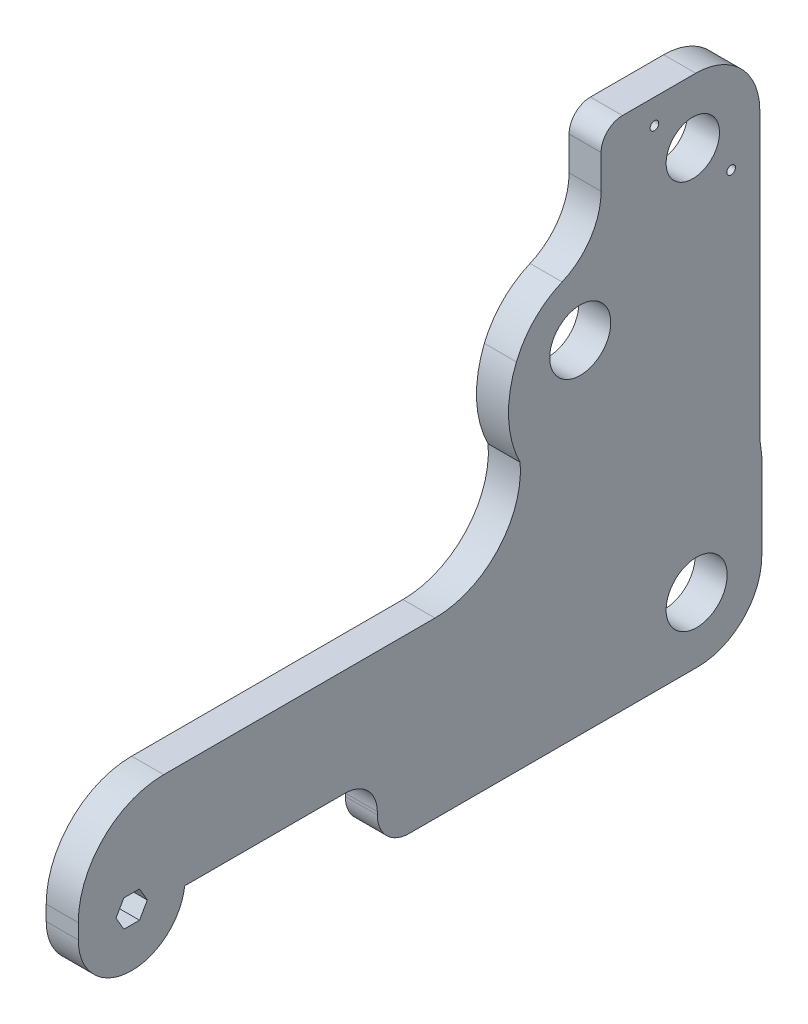
ISO-10303-21;
HEADER;
FILE_DESCRIPTION(('STEP AP214'),'2;1');
FILE_NAME('part.step','',(''),(''),'','','');
FILE_SCHEMA(('AUTOMOTIVE_DESIGN { 1 0 10303 214 1 1 1 1 }'));
ENDSEC;
DATA;
#1=APPLICATION_CONTEXT('core data for automotive mechanical design processes');
#2=APPLICATION_PROTOCOL_DEFINITION('international standard','automotive_design',2000,#1);
#3=PRODUCT_CONTEXT('',#1,'mechanical');
#4=PRODUCT('Part','Part','',(#3));
#5=PRODUCT_RELATED_PRODUCT_CATEGORY('part','',(#4));
#6=PRODUCT_DEFINITION_FORMATION('','',#4);
#7=PRODUCT_DEFINITION_CONTEXT('part definition',#1,'design');
#8=PRODUCT_DEFINITION('design','',#6,#7);
#9=PRODUCT_DEFINITION_SHAPE('','',#8);
#10=(LENGTH_UNIT() NAMED_UNIT(*) SI_UNIT(.MILLI.,.METRE.));
#11=(NAMED_UNIT(*) PLANE_ANGLE_UNIT() SI_UNIT($,.RADIAN.));
#12=(NAMED_UNIT(*) SI_UNIT($,.STERADIAN.) SOLID_ANGLE_UNIT());
#13=UNCERTAINTY_MEASURE_WITH_UNIT(LENGTH_MEASURE(1.E-05),#10,'distance_accuracy_value','');
#14=(GEOMETRIC_REPRESENTATION_CONTEXT(3) GLOBAL_UNCERTAINTY_ASSIGNED_CONTEXT((#13)) GLOBAL_UNIT_ASSIGNED_CONTEXT((#10,
#11,#12)) REPRESENTATION_CONTEXT('',''));
#15=CARTESIAN_POINT('',(0.,0.,0.));
#16=DIRECTION('',(0.,0.,1.));
#17=DIRECTION('',(1.,0.,0.));
#18=AXIS2_PLACEMENT_3D('',#15,#16,#17);
#19=CARTESIAN_POINT('',(15.,25.4000000000001,-90.));
#20=DIRECTION('',(1.,0.,0.));
#21=DIRECTION('',(0.,0.,-1.));
#22=AXIS2_PLACEMENT_3D('',#19,#20,#21);
#23=PLANE('',#22);
#24=CARTESIAN_POINT('',(15.,220.629214129618,-334.744996740449));
#25=DIRECTION('',(-1.,0.,0.));
#26=DIRECTION('',(0.,0.,1.));
#27=AXIS2_PLACEMENT_3D('',#24,#25,#26);
#28=CIRCLE('',#27,2.02000000001038);
#29=CARTESIAN_POINT('',(15.,220.629214129618,-332.724996740439));
#30=VERTEX_POINT('',#29);
#31=EDGE_CURVE('E264',#30,#30,#28,.T.);
#32=ORIENTED_EDGE('',*,*,#31,.T.);
#33=EDGE_LOOP('',(#32));
#34=FACE_BOUND('',#33,.T.);
#35=CARTESIAN_POINT('',(15.,184.708189645342,-370.666021224724));
#36=DIRECTION('',(-1.,0.,0.));
#37=DIRECTION('',(0.,0.,1.));
#38=AXIS2_PLACEMENT_3D('',#35,#36,#37);
#39=CIRCLE('',#38,2.0200000000083);
#40=CARTESIAN_POINT('',(15.,184.708189645342,-368.646021224716));
#41=VERTEX_POINT('',#40);
#42=EDGE_CURVE('E948',#41,#41,#39,.T.);
#43=ORIENTED_EDGE('',*,*,#42,.T.);
#44=EDGE_LOOP('',(#43));
#45=FACE_BOUND('',#44,.T.);
#46=CARTESIAN_POINT('',(15.,202.668701887479,-352.705508982585));
#47=DIRECTION('',(-1.,0.,0.));
#48=DIRECTION('',(0.,0.,1.));
#49=AXIS2_PLACEMENT_3D('',#46,#47,#48);
#50=CIRCLE('',#49,12.5000000000076);
#51=CARTESIAN_POINT('',(15.,202.668701887479,-340.205508982577));
#52=VERTEX_POINT('',#51);
#53=EDGE_CURVE('E954',#52,#52,#50,.T.);
#54=ORIENTED_EDGE('',*,*,#53,.T.);
#55=EDGE_LOOP('',(#54));
#56=FACE_BOUND('',#55,.T.);
#57=DIRECTION('',(0.,1.,0.));
#58=VECTOR('',#57,1.);
#59=CARTESIAN_POINT('',(15.,182.020805528476,-309.780230989161));
#60=LINE('',#59,#58);
#61=CARTESIAN_POINT('',(15.,206.52903796363,-309.780230989161));
#62=VERTEX_POINT('',#61);
#63=CARTESIAN_POINT('',(15.,222.254755045326,-309.780230989161));
#64=VERTEX_POINT('',#63);
#65=EDGE_CURVE('E223',#62,#64,#60,.T.);
#66=ORIENTED_EDGE('',*,*,#65,.F.);
#67=CARTESIAN_POINT('',(15.,206.52903796363,-279.780230989162));
#68=DIRECTION('',(1.,0.,0.));
#69=DIRECTION('',(0.,0.,-1.));
#70=AXIS2_PLACEMENT_3D('',#67,#68,#69);
#71=CIRCLE('',#70,30.);
#72=CARTESIAN_POINT('',(15.,178.919421923408,-291.515183145498));
#73=VERTEX_POINT('',#72);
#74=EDGE_CURVE('E11',#62,#73,#71,.F.);
#75=ORIENTED_EDGE('',*,*,#74,.T.);
#76=CARTESIAN_POINT('',(15.,142.106600536445,-307.161786020613));
#77=DIRECTION('',(1.,0.,0.));
#78=DIRECTION('',(0.,0.,-1.));
#79=AXIS2_PLACEMENT_3D('',#76,#77,#78);
#80=CIRCLE('',#79,40.);
#81=CARTESIAN_POINT('',(15.,157.195602303218,-270.116920982631));
#82=VERTEX_POINT('',#81);
#83=EDGE_CURVE('E526',#73,#82,#80,.T.);
#84=ORIENTED_EDGE('',*,*,#83,.T.);
#85=CARTESIAN_POINT('',(15.,138.334350094752,-316.423002280109));
#86=DIRECTION('',(-1.,0.,0.));
#87=DIRECTION('',(0.,0.,1.));
#88=AXIS2_PLACEMENT_3D('',#85,#86,#87);
#89=CIRCLE('',#88,50.);
#90=CARTESIAN_POINT('',(15.,115.607077366884,-271.8868251389));
#91=VERTEX_POINT('',#90);
#92=EDGE_CURVE('E305',#91,#82,#89,.T.);
#93=ORIENTED_EDGE('',*,*,#92,.F.);
#94=CARTESIAN_POINT('',(15.,112.4,-232.015599238976));
#95=DIRECTION('',(1.,0.,0.));
#96=DIRECTION('',(0.,0.,-1.));
#97=AXIS2_PLACEMENT_3D('',#94,#95,#96);
#98=CIRCLE('',#97,40.);
#99=CARTESIAN_POINT('',(15.,72.4,-232.015599238976));
#100=VERTEX_POINT('',#99);
#101=EDGE_CURVE('E520',#91,#100,#98,.F.);
#102=ORIENTED_EDGE('',*,*,#101,.T.);
#103=DIRECTION('',(0.,0.,-1.));
#104=VECTOR('',#103,1.);
#105=CARTESIAN_POINT('',(15.,72.4,-65.));
#106=LINE('',#105,#104);
#107=CARTESIAN_POINT('',(15.,72.4,-105.));
#108=VERTEX_POINT('',#107);
#109=EDGE_CURVE('E299',#108,#100,#106,.T.);
#110=ORIENTED_EDGE('',*,*,#109,.F.);
#111=CARTESIAN_POINT('',(15.,32.4000000000001,-105.));
#112=DIRECTION('',(1.,0.,0.));
#113=DIRECTION('',(0.,0.,-1.));
#114=AXIS2_PLACEMENT_3D('',#111,#112,#113);
#115=CIRCLE('',#114,40.);
#116=CARTESIAN_POINT('',(15.,32.4000000000001,-65.));
#117=VERTEX_POINT('',#116);
#118=EDGE_CURVE('E511',#108,#117,#115,.T.);
#119=ORIENTED_EDGE('',*,*,#118,.T.);
#120=DIRECTION('',(0.,1.,0.));
#121=VECTOR('',#120,1.);
#122=CARTESIAN_POINT('',(15.,25.4,-65.));
#123=LINE('',#122,#121);
#124=CARTESIAN_POINT('',(15.,25.4,-65.));
#125=VERTEX_POINT('',#124);
#126=EDGE_CURVE('E419',#125,#117,#123,.T.);
#127=ORIENTED_EDGE('',*,*,#126,.F.);
#128=CARTESIAN_POINT('',(15.,25.4000000000001,-90.));
#129=DIRECTION('',(1.,0.,0.));
#130=DIRECTION('',(0.,0.,-1.));
#131=AXIS2_PLACEMENT_3D('',#128,#129,#130);
#132=CIRCLE('',#131,25.);
#133=CARTESIAN_POINT('',(15.,22.4000000000001,-114.819347291982));
#134=VERTEX_POINT('',#133);
#135=EDGE_CURVE('E399',#125,#134,#132,.T.);
#136=ORIENTED_EDGE('',*,*,#135,.T.);
#137=DIRECTION('',(0.,0.,1.));
#138=VECTOR('',#137,1.);
#139=CARTESIAN_POINT('',(15.,22.4000000000001,-115.));
#140=LINE('',#139,#138);
#141=CARTESIAN_POINT('',(15.,22.4000000000001,-190.));
#142=VERTEX_POINT('',#141);
#143=EDGE_CURVE('E403',#142,#134,#140,.T.);
#144=ORIENTED_EDGE('',*,*,#143,.F.);
#145=CARTESIAN_POINT('',(15.,7.40000000000005,-190.));
#146=DIRECTION('',(1.,0.,0.));
#147=DIRECTION('',(0.,0.,-1.));
#148=AXIS2_PLACEMENT_3D('',#145,#146,#147);
#149=CIRCLE('',#148,15.);
#150=CARTESIAN_POINT('',(15.,7.40000000000005,-205.));
#151=VERTEX_POINT('',#150);
#152=EDGE_CURVE('E485',#142,#151,#149,.F.);
#153=ORIENTED_EDGE('',*,*,#152,.T.);
#154=DIRECTION('',(0.,-1.,0.));
#155=VECTOR('',#154,1.);
#156=CARTESIAN_POINT('',(15.,22.4000000000001,-205.));
#157=LINE('',#156,#155);
#158=CARTESIAN_POINT('',(15.,6.06162282000004,-205.));
#159=VERTEX_POINT('',#158);
#160=EDGE_CURVE('E407',#151,#159,#157,.T.);
#161=ORIENTED_EDGE('',*,*,#160,.T.);
#162=CARTESIAN_POINT('',(15.,6.06162282000004,-220.));
#163=DIRECTION('',(1.,0.,0.));
#164=DIRECTION('',(0.,0.,-1.));
#165=AXIS2_PLACEMENT_3D('',#162,#163,#164);
#166=CIRCLE('',#165,15.);
#167=CARTESIAN_POINT('',(15.,-8.93837717999996,-220.));
#168=VERTEX_POINT('',#167);
#169=EDGE_CURVE('E479',#159,#168,#166,.T.);
#170=ORIENTED_EDGE('',*,*,#169,.T.);
#171=DIRECTION('',(0.,0.,-1.));
#172=VECTOR('',#171,1.);
#173=CARTESIAN_POINT('',(15.,-8.93837717999996,-205.));
#174=LINE('',#173,#172);
#175=CARTESIAN_POINT('',(15.,-8.93837717999996,-355.));
#176=VERTEX_POINT('',#175);
#177=EDGE_CURVE('E411',#168,#176,#174,.T.);
#178=ORIENTED_EDGE('',*,*,#177,.T.);
#179=CARTESIAN_POINT('',(15.,21.06162282,-355.));
#180=DIRECTION('',(1.,0.,0.));
#181=DIRECTION('',(0.,0.,-1.));
#182=AXIS2_PLACEMENT_3D('',#179,#180,#181);
#183=CIRCLE('',#182,30.);
#184=CARTESIAN_POINT('',(15.,21.06162282,-385.));
#185=VERTEX_POINT('',#184);
#186=EDGE_CURVE('E498',#176,#185,#183,.T.);
#187=ORIENTED_EDGE('',*,*,#186,.T.);
#188=DIRECTION('',(0.,-1.,0.));
#189=VECTOR('',#188,1.);
#190=CARTESIAN_POINT('',(15.,281.06162282,-385.));
#191=LINE('',#190,#189);
#192=CARTESIAN_POINT('',(15.,61.0616228200001,-385.));
#193=VERTEX_POINT('',#192);
#194=EDGE_CURVE('E415',#193,#185,#191,.T.);
#195=ORIENTED_EDGE('',*,*,#194,.F.);
#196=CARTESIAN_POINT('',(15.,61.06162282,-165.));
#197=DIRECTION('',(1.,0.,0.));
#198=DIRECTION('',(0.,0.,-1.));
#199=AXIS2_PLACEMENT_3D('',#196,#197,#198);
#200=CIRCLE('',#199,220.);
#201=CARTESIAN_POINT('',(15.,61.5516614787209,-384.999454231398));
#202=VERTEX_POINT('',#201);
#203=EDGE_CURVE('E458',#193,#202,#200,.T.);
#204=ORIENTED_EDGE('',*,*,#203,.T.);
#205=CARTESIAN_POINT('',(15.,41.3040957033272,-196.081387122476));
#206=DIRECTION('',(-1.,0.,0.));
#207=DIRECTION('',(0.,0.,-1.));
#208=AXIS2_PLACEMENT_3D('',#205,#206,#207);
#209=CIRCLE('',#208,190.);
#210=CARTESIAN_POINT('',(15.,68.8062053431013,-384.080413653505));
#211=VERTEX_POINT('',#210);
#212=EDGE_CURVE('E281',#211,#202,#209,.T.);
#213=ORIENTED_EDGE('',*,*,#212,.F.);
#214=DIRECTION('',(0.,-1.,0.));
#215=VECTOR('',#214,1.);
#216=CARTESIAN_POINT('',(15.,202.254755045326,-384.080413653505));
#217=LINE('',#216,#215);
#218=CARTESIAN_POINT('',(15.,202.254755045326,-384.080413653505));
#219=VERTEX_POINT('',#218);
#220=EDGE_CURVE('E242',#219,#211,#217,.T.);
#221=ORIENTED_EDGE('',*,*,#220,.F.);
#222=CARTESIAN_POINT('',(15.,202.254755045326,-354.080413653505));
#223=DIRECTION('',(-1.,0.,0.));
#224=DIRECTION('',(0.,0.,1.));
#225=AXIS2_PLACEMENT_3D('',#222,#223,#224);
#226=CIRCLE('',#225,30.);
#227=CARTESIAN_POINT('',(15.,232.254755045326,-354.080413653505));
#228=VERTEX_POINT('',#227);
#229=EDGE_CURVE('E252',#228,#219,#226,.T.);
#230=ORIENTED_EDGE('',*,*,#229,.F.);
#231=DIRECTION('',(0.,0.,-1.));
#232=VECTOR('',#231,1.);
#233=CARTESIAN_POINT('',(15.,232.254755045326,-354.080413653505));
#234=LINE('',#233,#232);
#235=CARTESIAN_POINT('',(15.,232.254755045326,-319.780230989161));
#236=VERTEX_POINT('',#235);
#237=EDGE_CURVE('E248',#236,#228,#234,.T.);
#238=ORIENTED_EDGE('',*,*,#237,.F.);
#239=CARTESIAN_POINT('',(15.,222.254755045326,-319.780230989161));
#240=DIRECTION('',(-1.,0.,0.));
#241=DIRECTION('',(0.,0.,-1.));
#242=AXIS2_PLACEMENT_3D('',#239,#240,#241);
#243=CIRCLE('',#242,10.);
#244=EDGE_CURVE('E232',#64,#236,#243,.T.);
#245=ORIENTED_EDGE('',*,*,#244,.F.);
#246=EDGE_LOOP('',(#66,#75,#84,#93,#102,#110,#119,#127,#136,#144,#153,#161,#170,#178,#187,#195,
#204,#213,#221,#230,#238,#245));
#247=FACE_BOUND('',#246,.T.);
#248=DIRECTION('',(0.,0.866025403784439,0.499999999999999));
#249=VECTOR('',#248,1.);
#250=CARTESIAN_POINT('',(15.,19.05,-86.3338257906459));
#251=LINE('',#250,#249);
#252=CARTESIAN_POINT('',(15.,19.05,-86.3338257906459));
#253=VERTEX_POINT('',#252);
#254=CARTESIAN_POINT('',(15.,25.4,-82.6676515812918));
#255=VERTEX_POINT('',#254);
#256=EDGE_CURVE('E333',#253,#255,#251,.T.);
#257=ORIENTED_EDGE('',*,*,#256,.T.);
#258=DIRECTION('',(0.,0.866025403784439,-0.5));
#259=VECTOR('',#258,1.);
#260=CARTESIAN_POINT('',(15.,25.4,-82.6676515812918));
#261=LINE('',#260,#259);
#262=CARTESIAN_POINT('',(15.,31.75,-86.3338257906459));
#263=VERTEX_POINT('',#262);
#264=EDGE_CURVE('E337',#255,#263,#261,.T.);
#265=ORIENTED_EDGE('',*,*,#264,.T.);
#266=DIRECTION('',(0.,0.,-1.));
#267=VECTOR('',#266,1.);
#268=CARTESIAN_POINT('',(15.,31.75,-86.3338257906459));
#269=LINE('',#268,#267);
#270=CARTESIAN_POINT('',(15.,31.75,-93.6661742093541));
#271=VERTEX_POINT('',#270);
#272=EDGE_CURVE('E342',#263,#271,#269,.T.);
#273=ORIENTED_EDGE('',*,*,#272,.T.);
#274=DIRECTION('',(0.,-0.866025403784439,-0.5));
#275=VECTOR('',#274,1.);
#276=CARTESIAN_POINT('',(15.,31.75,-93.6661742093541));
#277=LINE('',#276,#275);
#278=CARTESIAN_POINT('',(15.,25.4,-97.3323484187082));
#279=VERTEX_POINT('',#278);
#280=EDGE_CURVE('E346',#271,#279,#277,.T.);
#281=ORIENTED_EDGE('',*,*,#280,.T.);
#282=DIRECTION('',(0.,-0.866025403784439,0.5));
#283=VECTOR('',#282,1.);
#284=CARTESIAN_POINT('',(15.,25.4,-97.3323484187082));
#285=LINE('',#284,#283);
#286=CARTESIAN_POINT('',(15.,19.05,-93.6661742093541));
#287=VERTEX_POINT('',#286);
#288=EDGE_CURVE('E350',#279,#287,#285,.T.);
#289=ORIENTED_EDGE('',*,*,#288,.T.);
#290=DIRECTION('',(0.,0.,1.));
#291=VECTOR('',#290,1.);
#292=CARTESIAN_POINT('',(15.,19.05,-93.6661742093541));
#293=LINE('',#292,#291);
#294=EDGE_CURVE('E354',#287,#253,#293,.T.);
#295=ORIENTED_EDGE('',*,*,#294,.T.);
#296=EDGE_LOOP('',(#257,#265,#273,#281,#289,#295));
#297=FACE_BOUND('',#296,.T.);
#298=CARTESIAN_POINT('',(15.,21.5616228227509,-354.499999997544));
#299=DIRECTION('',(1.,0.,0.));
#300=DIRECTION('',(0.,0.,-1.));
#301=AXIS2_PLACEMENT_3D('',#298,#299,#300);
#302=CIRCLE('',#301,14.29);
#303=CARTESIAN_POINT('',(15.,21.5616228227509,-368.789999997544));
#304=VERTEX_POINT('',#303);
#305=EDGE_CURVE('E329',#304,#304,#302,.T.);
#306=ORIENTED_EDGE('',*,*,#305,.F.);
#307=EDGE_LOOP('',(#306));
#308=FACE_BOUND('',#307,.T.);
#309=CARTESIAN_POINT('',(15.,151.061622822751,-299.999999997544));
#310=DIRECTION('',(1.,0.,0.));
#311=DIRECTION('',(0.,0.,-1.));
#312=AXIS2_PLACEMENT_3D('',#309,#310,#311);
#313=CIRCLE('',#312,14.2899999999392);
#314=CARTESIAN_POINT('',(15.,151.061622822751,-314.289999997483));
#315=VERTEX_POINT('',#314);
#316=EDGE_CURVE('E319',#315,#315,#313,.T.);
#317=ORIENTED_EDGE('',*,*,#316,.F.);
#318=EDGE_LOOP('',(#317));
#319=FACE_BOUND('',#318,.T.);
#320=ADVANCED_FACE('F41',(#34,#45,#56,#247,#297,#308,#319),#23,.T.);
#321=CARTESIAN_POINT('',(0.,25.4000000000001,-90.));
#322=DIRECTION('',(1.,0.,0.));
#323=DIRECTION('',(0.,0.,-1.));
#324=AXIS2_PLACEMENT_3D('',#321,#322,#323);
#325=PLANE('',#324);
#326=CARTESIAN_POINT('',(0.,220.629214129618,-334.744996740449));
#327=DIRECTION('',(-1.,0.,0.));
#328=DIRECTION('',(0.,0.,1.));
#329=AXIS2_PLACEMENT_3D('',#326,#327,#328);
#330=CIRCLE('',#329,2.02000000001038);
#331=CARTESIAN_POINT('',(0.,220.629214129618,-332.724996740439));
#332=VERTEX_POINT('',#331);
#333=EDGE_CURVE('E958',#332,#332,#330,.T.);
#334=ORIENTED_EDGE('',*,*,#333,.F.);
#335=EDGE_LOOP('',(#334));
#336=FACE_BOUND('',#335,.T.);
#337=CARTESIAN_POINT('',(0.,184.708189645342,-370.666021224724));
#338=DIRECTION('',(-1.,0.,0.));
#339=DIRECTION('',(0.,0.,1.));
#340=AXIS2_PLACEMENT_3D('',#337,#338,#339);
#341=CIRCLE('',#340,2.0200000000083);
#342=CARTESIAN_POINT('',(0.,184.708189645342,-368.646021224716));
#343=VERTEX_POINT('',#342);
#344=EDGE_CURVE('E951',#343,#343,#341,.T.);
#345=ORIENTED_EDGE('',*,*,#344,.F.);
#346=EDGE_LOOP('',(#345));
#347=FACE_BOUND('',#346,.T.);
#348=CARTESIAN_POINT('',(0.,202.668701887479,-352.705508982585));
#349=DIRECTION('',(-1.,0.,0.));
#350=DIRECTION('',(0.,0.,1.));
#351=AXIS2_PLACEMENT_3D('',#348,#349,#350);
#352=CIRCLE('',#351,12.5000000000076);
#353=CARTESIAN_POINT('',(0.,202.668701887479,-340.205508982577));
#354=VERTEX_POINT('',#353);
#355=EDGE_CURVE('E961',#354,#354,#352,.T.);
#356=ORIENTED_EDGE('',*,*,#355,.F.);
#357=EDGE_LOOP('',(#356));
#358=FACE_BOUND('',#357,.T.);
#359=CARTESIAN_POINT('',(0.,151.061622822751,-299.999999997544));
#360=DIRECTION('',(1.,0.,0.));
#361=DIRECTION('',(0.,0.,-1.));
#362=AXIS2_PLACEMENT_3D('',#359,#360,#361);
#363=CIRCLE('',#362,14.2899999999392);
#364=CARTESIAN_POINT('',(0.,151.061622822751,-314.289999997483));
#365=VERTEX_POINT('',#364);
#366=EDGE_CURVE('E323',#365,#365,#363,.T.);
#367=ORIENTED_EDGE('',*,*,#366,.T.);
#368=EDGE_LOOP('',(#367));
#369=FACE_BOUND('',#368,.T.);
#370=CARTESIAN_POINT('',(0.,21.5616228227509,-354.499999997544));
#371=DIRECTION('',(1.,0.,0.));
#372=DIRECTION('',(0.,0.,-1.));
#373=AXIS2_PLACEMENT_3D('',#370,#371,#372);
#374=CIRCLE('',#373,14.29);
#375=CARTESIAN_POINT('',(0.,21.5616228227509,-368.789999997544));
#376=VERTEX_POINT('',#375);
#377=EDGE_CURVE('E324',#376,#376,#374,.T.);
#378=ORIENTED_EDGE('',*,*,#377,.T.);
#379=EDGE_LOOP('',(#378));
#380=FACE_BOUND('',#379,.T.);
#381=DIRECTION('',(0.,0.866025403784439,-0.5));
#382=VECTOR('',#381,1.);
#383=CARTESIAN_POINT('',(0.,25.4,-82.6676515812918));
#384=LINE('',#383,#382);
#385=CARTESIAN_POINT('',(0.,25.4,-82.6676515812918));
#386=VERTEX_POINT('',#385);
#387=CARTESIAN_POINT('',(0.,31.75,-86.3338257906459));
#388=VERTEX_POINT('',#387);
#389=EDGE_CURVE('E361',#386,#388,#384,.T.);
#390=ORIENTED_EDGE('',*,*,#389,.F.);
#391=DIRECTION('',(0.,0.866025403784439,0.499999999999999));
#392=VECTOR('',#391,1.);
#393=CARTESIAN_POINT('',(0.,19.05,-86.3338257906459));
#394=LINE('',#393,#392);
#395=CARTESIAN_POINT('',(0.,19.05,-86.3338257906459));
#396=VERTEX_POINT('',#395);
#397=EDGE_CURVE('E328',#396,#386,#394,.T.);
#398=ORIENTED_EDGE('',*,*,#397,.F.);
#399=DIRECTION('',(0.,0.,1.));
#400=VECTOR('',#399,1.);
#401=CARTESIAN_POINT('',(0.,19.05,-93.6661742093541));
#402=LINE('',#401,#400);
#403=CARTESIAN_POINT('',(0.,19.05,-93.6661742093541));
#404=VERTEX_POINT('',#403);
#405=EDGE_CURVE('E338',#404,#396,#402,.T.);
#406=ORIENTED_EDGE('',*,*,#405,.F.);
#407=DIRECTION('',(0.,-0.866025403784439,0.5));
#408=VECTOR('',#407,1.);
#409=CARTESIAN_POINT('',(0.,25.4,-97.3323484187082));
#410=LINE('',#409,#408);
#411=CARTESIAN_POINT('',(0.,25.4,-97.3323484187082));
#412=VERTEX_POINT('',#411);
#413=EDGE_CURVE('E373',#412,#404,#410,.T.);
#414=ORIENTED_EDGE('',*,*,#413,.F.);
#415=DIRECTION('',(0.,-0.866025403784439,-0.5));
#416=VECTOR('',#415,1.);
#417=CARTESIAN_POINT('',(0.,31.75,-93.6661742093541));
#418=LINE('',#417,#416);
#419=CARTESIAN_POINT('',(0.,31.75,-93.6661742093541));
#420=VERTEX_POINT('',#419);
#421=EDGE_CURVE('E369',#420,#412,#418,.T.);
#422=ORIENTED_EDGE('',*,*,#421,.F.);
#423=DIRECTION('',(0.,0.,-1.));
#424=VECTOR('',#423,1.);
#425=CARTESIAN_POINT('',(0.,31.75,-86.3338257906459));
#426=LINE('',#425,#424);
#427=EDGE_CURVE('E365',#388,#420,#426,.T.);
#428=ORIENTED_EDGE('',*,*,#427,.F.);
#429=EDGE_LOOP('',(#390,#398,#406,#414,#422,#428));
#430=FACE_BOUND('',#429,.T.);
#431=CARTESIAN_POINT('',(0.,142.106600536445,-307.161786020613));
#432=DIRECTION('',(1.,0.,0.));
#433=DIRECTION('',(0.,0.,-1.));
#434=AXIS2_PLACEMENT_3D('',#431,#432,#433);
#435=CIRCLE('',#434,40.);
#436=CARTESIAN_POINT('',(0.,157.195602303218,-270.116920982631));
#437=VERTEX_POINT('',#436);
#438=CARTESIAN_POINT('',(0.,178.919421923408,-291.515183145498));
#439=VERTEX_POINT('',#438);
#440=EDGE_CURVE('E532',#437,#439,#435,.F.);
#441=ORIENTED_EDGE('',*,*,#440,.T.);
#442=CARTESIAN_POINT('',(0.,206.52903796363,-279.780230989162));
#443=DIRECTION('',(1.,0.,0.));
#444=DIRECTION('',(0.,0.,-1.));
#445=AXIS2_PLACEMENT_3D('',#442,#443,#444);
#446=CIRCLE('',#445,30.);
#447=CARTESIAN_POINT('',(0.,206.52903796363,-309.780230989161));
#448=VERTEX_POINT('',#447);
#449=EDGE_CURVE('E50',#439,#448,#446,.T.);
#450=ORIENTED_EDGE('',*,*,#449,.T.);
#451=DIRECTION('',(0.,1.,0.));
#452=VECTOR('',#451,1.);
#453=CARTESIAN_POINT('',(0.,182.020805528476,-309.780230989161));
#454=LINE('',#453,#452);
#455=CARTESIAN_POINT('',(0.,222.254755045326,-309.780230989161));
#456=VERTEX_POINT('',#455);
#457=EDGE_CURVE('E261',#448,#456,#454,.T.);
#458=ORIENTED_EDGE('',*,*,#457,.T.);
#459=CARTESIAN_POINT('',(0.,222.254755045326,-319.780230989161));
#460=DIRECTION('',(-1.,0.,0.));
#461=DIRECTION('',(0.,0.,-1.));
#462=AXIS2_PLACEMENT_3D('',#459,#460,#461);
#463=CIRCLE('',#462,10.);
#464=CARTESIAN_POINT('',(0.,232.254755045326,-319.780230989161));
#465=VERTEX_POINT('',#464);
#466=EDGE_CURVE('E239',#456,#465,#463,.T.);
#467=ORIENTED_EDGE('',*,*,#466,.T.);
#468=DIRECTION('',(0.,0.,-1.));
#469=VECTOR('',#468,1.);
#470=CARTESIAN_POINT('',(0.,232.254755045326,-354.080413653505));
#471=LINE('',#470,#469);
#472=CARTESIAN_POINT('',(0.,232.254755045326,-354.080413653505));
#473=VERTEX_POINT('',#472);
#474=EDGE_CURVE('E267',#465,#473,#471,.T.);
#475=ORIENTED_EDGE('',*,*,#474,.T.);
#476=CARTESIAN_POINT('',(0.,202.254755045326,-354.080413653505));
#477=DIRECTION('',(-1.,0.,0.));
#478=DIRECTION('',(0.,0.,1.));
#479=AXIS2_PLACEMENT_3D('',#476,#477,#478);
#480=CIRCLE('',#479,30.);
#481=CARTESIAN_POINT('',(0.,202.254755045326,-384.080413653505));
#482=VERTEX_POINT('',#481);
#483=EDGE_CURVE('E271',#473,#482,#480,.T.);
#484=ORIENTED_EDGE('',*,*,#483,.T.);
#485=DIRECTION('',(0.,-1.,0.));
#486=VECTOR('',#485,1.);
#487=CARTESIAN_POINT('',(0.,202.254755045326,-384.080413653505));
#488=LINE('',#487,#486);
#489=CARTESIAN_POINT('',(0.,68.8062053431013,-384.080413653505));
#490=VERTEX_POINT('',#489);
#491=EDGE_CURVE('E233',#482,#490,#488,.T.);
#492=ORIENTED_EDGE('',*,*,#491,.T.);
#493=CARTESIAN_POINT('',(0.,41.3040957033272,-196.081387122476));
#494=DIRECTION('',(-1.,0.,0.));
#495=DIRECTION('',(0.,0.,-1.));
#496=AXIS2_PLACEMENT_3D('',#493,#494,#495);
#497=CIRCLE('',#496,190.);
#498=CARTESIAN_POINT('',(0.,61.5516614787209,-384.999454231398));
#499=VERTEX_POINT('',#498);
#500=EDGE_CURVE('E290',#490,#499,#497,.T.);
#501=ORIENTED_EDGE('',*,*,#500,.T.);
#502=CARTESIAN_POINT('',(0.,61.06162282,-165.));
#503=DIRECTION('',(1.,0.,0.));
#504=DIRECTION('',(0.,0.,-1.));
#505=AXIS2_PLACEMENT_3D('',#502,#503,#504);
#506=CIRCLE('',#505,220.);
#507=CARTESIAN_POINT('',(0.,61.0616228200001,-385.));
#508=VERTEX_POINT('',#507);
#509=EDGE_CURVE('E452',#499,#508,#506,.F.);
#510=ORIENTED_EDGE('',*,*,#509,.T.);
#511=DIRECTION('',(0.,-1.,0.));
#512=VECTOR('',#511,1.);
#513=CARTESIAN_POINT('',(0.,281.06162282,-385.));
#514=LINE('',#513,#512);
#515=CARTESIAN_POINT('',(0.,21.06162282,-385.));
#516=VERTEX_POINT('',#515);
#517=EDGE_CURVE('E439',#508,#516,#514,.T.);
#518=ORIENTED_EDGE('',*,*,#517,.T.);
#519=CARTESIAN_POINT('',(0.,21.06162282,-355.));
#520=DIRECTION('',(1.,0.,0.));
#521=DIRECTION('',(0.,0.,-1.));
#522=AXIS2_PLACEMENT_3D('',#519,#520,#521);
#523=CIRCLE('',#522,30.);
#524=CARTESIAN_POINT('',(0.,-8.93837717999996,-355.));
#525=VERTEX_POINT('',#524);
#526=EDGE_CURVE('E492',#516,#525,#523,.F.);
#527=ORIENTED_EDGE('',*,*,#526,.T.);
#528=DIRECTION('',(0.,0.,-1.));
#529=VECTOR('',#528,1.);
#530=CARTESIAN_POINT('',(0.,-8.93837717999996,-205.));
#531=LINE('',#530,#529);
#532=CARTESIAN_POINT('',(0.,-8.93837717999996,-220.));
#533=VERTEX_POINT('',#532);
#534=EDGE_CURVE('E435',#533,#525,#531,.T.);
#535=ORIENTED_EDGE('',*,*,#534,.F.);
#536=CARTESIAN_POINT('',(0.,6.06162282000004,-220.));
#537=DIRECTION('',(1.,0.,0.));
#538=DIRECTION('',(0.,0.,-1.));
#539=AXIS2_PLACEMENT_3D('',#536,#537,#538);
#540=CIRCLE('',#539,15.);
#541=CARTESIAN_POINT('',(0.,6.06162282000004,-205.));
#542=VERTEX_POINT('',#541);
#543=EDGE_CURVE('E476',#533,#542,#540,.F.);
#544=ORIENTED_EDGE('',*,*,#543,.T.);
#545=DIRECTION('',(0.,-1.,0.));
#546=VECTOR('',#545,1.);
#547=CARTESIAN_POINT('',(0.,22.4000000000001,-205.));
#548=LINE('',#547,#546);
#549=CARTESIAN_POINT('',(0.,7.40000000000005,-205.));
#550=VERTEX_POINT('',#549);
#551=EDGE_CURVE('E431',#550,#542,#548,.T.);
#552=ORIENTED_EDGE('',*,*,#551,.F.);
#553=CARTESIAN_POINT('',(0.,7.40000000000005,-190.));
#554=DIRECTION('',(1.,0.,0.));
#555=DIRECTION('',(0.,0.,-1.));
#556=AXIS2_PLACEMENT_3D('',#553,#554,#555);
#557=CIRCLE('',#556,15.);
#558=CARTESIAN_POINT('',(0.,22.4000000000001,-190.));
#559=VERTEX_POINT('',#558);
#560=EDGE_CURVE('E482',#550,#559,#557,.T.);
#561=ORIENTED_EDGE('',*,*,#560,.T.);
#562=DIRECTION('',(0.,0.,-1.));
#563=VECTOR('',#562,1.);
#564=CARTESIAN_POINT('',(0.,22.4000000000001,-115.));
#565=LINE('',#564,#563);
#566=CARTESIAN_POINT('',(0.,22.4000000000001,-114.819347291982));
#567=VERTEX_POINT('',#566);
#568=EDGE_CURVE('E427',#567,#559,#565,.T.);
#569=ORIENTED_EDGE('',*,*,#568,.F.);
#570=CARTESIAN_POINT('',(0.,25.4000000000001,-90.));
#571=DIRECTION('',(1.,0.,0.));
#572=DIRECTION('',(0.,0.,-1.));
#573=AXIS2_PLACEMENT_3D('',#570,#571,#572);
#574=CIRCLE('',#573,25.);
#575=CARTESIAN_POINT('',(0.,25.4,-65.));
#576=VERTEX_POINT('',#575);
#577=EDGE_CURVE('E383',#576,#567,#574,.T.);
#578=ORIENTED_EDGE('',*,*,#577,.F.);
#579=DIRECTION('',(0.,1.,0.));
#580=VECTOR('',#579,1.);
#581=CARTESIAN_POINT('',(0.,25.4,-65.));
#582=LINE('',#581,#580);
#583=CARTESIAN_POINT('',(0.,32.4000000000001,-65.));
#584=VERTEX_POINT('',#583);
#585=EDGE_CURVE('E404',#576,#584,#582,.T.);
#586=ORIENTED_EDGE('',*,*,#585,.T.);
#587=CARTESIAN_POINT('',(0.,32.4000000000001,-105.));
#588=DIRECTION('',(1.,0.,0.));
#589=DIRECTION('',(0.,0.,-1.));
#590=AXIS2_PLACEMENT_3D('',#587,#588,#589);
#591=CIRCLE('',#590,40.);
#592=CARTESIAN_POINT('',(0.,72.4,-105.));
#593=VERTEX_POINT('',#592);
#594=EDGE_CURVE('E517',#584,#593,#591,.F.);
#595=ORIENTED_EDGE('',*,*,#594,.T.);
#596=DIRECTION('',(0.,0.,-1.));
#597=VECTOR('',#596,1.);
#598=CARTESIAN_POINT('',(0.,72.4,-65.));
#599=LINE('',#598,#597);
#600=CARTESIAN_POINT('',(0.,72.4,-232.015599238976));
#601=VERTEX_POINT('',#600);
#602=EDGE_CURVE('E300',#593,#601,#599,.T.);
#603=ORIENTED_EDGE('',*,*,#602,.T.);
#604=CARTESIAN_POINT('',(0.,112.4,-232.015599238976));
#605=DIRECTION('',(1.,0.,0.));
#606=DIRECTION('',(0.,0.,-1.));
#607=AXIS2_PLACEMENT_3D('',#604,#605,#606);
#608=CIRCLE('',#607,40.);
#609=CARTESIAN_POINT('',(0.,115.607077366884,-271.8868251389));
#610=VERTEX_POINT('',#609);
#611=EDGE_CURVE('E523',#601,#610,#608,.T.);
#612=ORIENTED_EDGE('',*,*,#611,.T.);
#613=CARTESIAN_POINT('',(0.,138.334350094752,-316.423002280109));
#614=DIRECTION('',(-1.,0.,0.));
#615=DIRECTION('',(0.,0.,1.));
#616=AXIS2_PLACEMENT_3D('',#613,#614,#615);
#617=CIRCLE('',#616,50.);
#618=EDGE_CURVE('E304',#610,#437,#617,.T.);
#619=ORIENTED_EDGE('',*,*,#618,.T.);
#620=EDGE_LOOP('',(#441,#450,#458,#467,#475,#484,#492,#501,#510,#518,#527,#535,#544,#552,#561,
#569,#578,#586,#595,#603,#612,#619));
#621=FACE_BOUND('',#620,.T.);
#622=ADVANCED_FACE('F548',(#336,#347,#358,#369,#380,#430,#621),#325,.F.);
#623=CARTESIAN_POINT('',(15.,61.06162282,-165.));
#624=DIRECTION('',(-1.,0.,0.));
#625=DIRECTION('',(0.,0.,1.));
#626=AXIS2_PLACEMENT_3D('',#623,#624,#625);
#627=CYLINDRICAL_SURFACE('',#626,220.);
#628=DIRECTION('',(1.,0.,0.));
#629=VECTOR('',#628,1.);
#630=CARTESIAN_POINT('',(7.5,61.5516614787209,-384.999454231398));
#631=LINE('',#630,#629);
#632=EDGE_CURVE('E293',#202,#499,#631,.F.);
#633=ORIENTED_EDGE('',*,*,#632,.F.);
#634=ORIENTED_EDGE('',*,*,#203,.F.);
#635=DIRECTION('',(-1.,0.,0.));
#636=VECTOR('',#635,1.);
#637=CARTESIAN_POINT('',(15.,61.0616228200001,-385.));
#638=LINE('',#637,#636);
#639=EDGE_CURVE('E455',#508,#193,#638,.F.);
#640=ORIENTED_EDGE('',*,*,#639,.F.);
#641=ORIENTED_EDGE('',*,*,#509,.F.);
#642=EDGE_LOOP('',(#633,#634,#640,#641));
#643=FACE_BOUND('',#642,.T.);
#644=ADVANCED_FACE('F610',(#643),#627,.T.);
#645=CARTESIAN_POINT('',(15.,25.4000000000001,-90.));
#646=DIRECTION('',(-1.,0.,0.));
#647=DIRECTION('',(0.,0.,1.));
#648=AXIS2_PLACEMENT_3D('',#645,#646,#647);
#649=CYLINDRICAL_SURFACE('',#648,25.);
#650=ORIENTED_EDGE('',*,*,#577,.T.);
#651=DIRECTION('',(-1.,0.,0.));
#652=VECTOR('',#651,1.);
#653=CARTESIAN_POINT('',(15.,22.4000000000001,-114.819347291982));
#654=LINE('',#653,#652);
#655=EDGE_CURVE('E448',#134,#567,#654,.T.);
#656=ORIENTED_EDGE('',*,*,#655,.F.);
#657=ORIENTED_EDGE('',*,*,#135,.F.);
#658=DIRECTION('',(-1.,0.,0.));
#659=VECTOR('',#658,1.);
#660=CARTESIAN_POINT('',(15.,25.4,-65.));
#661=LINE('',#660,#659);
#662=EDGE_CURVE('E423',#125,#576,#661,.T.);
#663=ORIENTED_EDGE('',*,*,#662,.T.);
#664=EDGE_LOOP('',(#650,#656,#657,#663));
#665=FACE_BOUND('',#664,.T.);
#666=ADVANCED_FACE('F575',(#665),#649,.T.);
#667=CARTESIAN_POINT('',(15.,22.4000000000001,-115.));
#668=DIRECTION('',(0.,1.,0.));
#669=DIRECTION('',(0.,0.,1.));
#670=AXIS2_PLACEMENT_3D('',#667,#668,#669);
#671=PLANE('',#670);
#672=ORIENTED_EDGE('',*,*,#568,.T.);
#673=DIRECTION('',(-1.,0.,0.));
#674=VECTOR('',#673,1.);
#675=CARTESIAN_POINT('',(15.,22.4,-190.));
#676=LINE('',#675,#674);
#677=EDGE_CURVE('E469',#559,#142,#676,.F.);
#678=ORIENTED_EDGE('',*,*,#677,.T.);
#679=ORIENTED_EDGE('',*,*,#143,.T.);
#680=ORIENTED_EDGE('',*,*,#655,.T.);
#681=EDGE_LOOP('',(#672,#678,#679,#680));
#682=FACE_BOUND('',#681,.T.);
#683=ADVANCED_FACE('F656',(#682),#671,.F.);
#684=CARTESIAN_POINT('',(15.,22.4000000000001,-205.));
#685=DIRECTION('',(0.,0.,-1.));
#686=DIRECTION('',(-1.,0.,0.));
#687=AXIS2_PLACEMENT_3D('',#684,#685,#686);
#688=PLANE('',#687);
#689=ORIENTED_EDGE('',*,*,#160,.F.);
#690=DIRECTION('',(-1.,0.,0.));
#691=VECTOR('',#690,1.);
#692=CARTESIAN_POINT('',(0.,7.40000000000005,-205.));
#693=LINE('',#692,#691);
#694=EDGE_CURVE('E465',#151,#550,#693,.T.);
#695=ORIENTED_EDGE('',*,*,#694,.T.);
#696=ORIENTED_EDGE('',*,*,#551,.T.);
#697=DIRECTION('',(-1.,0.,0.));
#698=VECTOR('',#697,1.);
#699=CARTESIAN_POINT('',(15.,6.06162282000004,-205.));
#700=LINE('',#699,#698);
#701=EDGE_CURVE('E462',#542,#159,#700,.F.);
#702=ORIENTED_EDGE('',*,*,#701,.T.);
#703=EDGE_LOOP('',(#689,#695,#696,#702));
#704=FACE_BOUND('',#703,.T.);
#705=ADVANCED_FACE('F586',(#704),#688,.F.);
#706=CARTESIAN_POINT('',(15.,-8.93837717999996,-205.));
#707=DIRECTION('',(0.,1.,0.));
#708=DIRECTION('',(0.,0.,1.));
#709=AXIS2_PLACEMENT_3D('',#706,#707,#708);
#710=PLANE('',#709);
#711=ORIENTED_EDGE('',*,*,#534,.T.);
#712=DIRECTION('',(-1.,0.,0.));
#713=VECTOR('',#712,1.);
#714=CARTESIAN_POINT('',(15.,-8.93837717999996,-355.));
#715=LINE('',#714,#713);
#716=EDGE_CURVE('E495',#525,#176,#715,.F.);
#717=ORIENTED_EDGE('',*,*,#716,.T.);
#718=ORIENTED_EDGE('',*,*,#177,.F.);
#719=DIRECTION('',(-1.,0.,0.));
#720=VECTOR('',#719,1.);
#721=CARTESIAN_POINT('',(15.,-8.93837717999996,-220.));
#722=LINE('',#721,#720);
#723=EDGE_CURVE('E472',#168,#533,#722,.T.);
#724=ORIENTED_EDGE('',*,*,#723,.T.);
#725=EDGE_LOOP('',(#711,#717,#718,#724));
#726=FACE_BOUND('',#725,.T.);
#727=ADVANCED_FACE('F595',(#726),#710,.F.);
#728=CARTESIAN_POINT('',(15.,281.06162282,-385.));
#729=DIRECTION('',(0.,0.,-1.));
#730=DIRECTION('',(0.,1.,0.));
#731=AXIS2_PLACEMENT_3D('',#728,#729,#730);
#732=PLANE('',#731);
#733=ORIENTED_EDGE('',*,*,#194,.T.);
#734=DIRECTION('',(-1.,0.,0.));
#735=VECTOR('',#734,1.);
#736=CARTESIAN_POINT('',(0.,21.06162282,-385.));
#737=LINE('',#736,#735);
#738=EDGE_CURVE('E488',#185,#516,#737,.T.);
#739=ORIENTED_EDGE('',*,*,#738,.T.);
#740=ORIENTED_EDGE('',*,*,#517,.F.);
#741=ORIENTED_EDGE('',*,*,#639,.T.);
#742=EDGE_LOOP('',(#733,#739,#740,#741));
#743=FACE_BOUND('',#742,.T.);
#744=ADVANCED_FACE('F604',(#743),#732,.T.);
#745=CARTESIAN_POINT('',(15.,25.4,-65.));
#746=DIRECTION('',(0.,0.,1.));
#747=DIRECTION('',(1.,0.,0.));
#748=AXIS2_PLACEMENT_3D('',#745,#746,#747);
#749=PLANE('',#748);
#750=ORIENTED_EDGE('',*,*,#126,.T.);
#751=DIRECTION('',(1.,0.,0.));
#752=VECTOR('',#751,1.);
#753=CARTESIAN_POINT('',(0.,32.4000000000001,-65.));
#754=LINE('',#753,#752);
#755=EDGE_CURVE('E514',#117,#584,#754,.F.);
#756=ORIENTED_EDGE('',*,*,#755,.T.);
#757=ORIENTED_EDGE('',*,*,#585,.F.);
#758=ORIENTED_EDGE('',*,*,#662,.F.);
#759=EDGE_LOOP('',(#750,#756,#757,#758));
#760=FACE_BOUND('',#759,.T.);
#761=ADVANCED_FACE('F569',(#760),#749,.T.);
#762=CARTESIAN_POINT('',(15.,19.05,-86.3338257906459));
#763=DIRECTION('',(0.,-0.499999999999999,0.866025403784439));
#764=DIRECTION('',(0.,-0.866025403784439,-0.499999999999999));
#765=AXIS2_PLACEMENT_3D('',#762,#763,#764);
#766=PLANE('',#765);
#767=ORIENTED_EDGE('',*,*,#397,.T.);
#768=DIRECTION('',(-1.,0.,0.));
#769=VECTOR('',#768,1.);
#770=CARTESIAN_POINT('',(15.,25.4,-82.6676515812918));
#771=LINE('',#770,#769);
#772=EDGE_CURVE('E358',#255,#386,#771,.T.);
#773=ORIENTED_EDGE('',*,*,#772,.F.);
#774=ORIENTED_EDGE('',*,*,#256,.F.);
#775=DIRECTION('',(-1.,0.,0.));
#776=VECTOR('',#775,1.);
#777=CARTESIAN_POINT('',(15.,19.05,-86.3338257906459));
#778=LINE('',#777,#776);
#779=EDGE_CURVE('E380',#253,#396,#778,.T.);
#780=ORIENTED_EDGE('',*,*,#779,.T.);
#781=EDGE_LOOP('',(#767,#773,#774,#780));
#782=FACE_BOUND('',#781,.T.);
#783=ADVANCED_FACE('F645',(#782),#766,.F.);
#784=CARTESIAN_POINT('',(15.,19.05,-93.6661742093541));
#785=DIRECTION('',(0.,-1.,0.));
#786=DIRECTION('',(0.,0.,-1.));
#787=AXIS2_PLACEMENT_3D('',#784,#785,#786);
#788=PLANE('',#787);
#789=ORIENTED_EDGE('',*,*,#405,.T.);
#790=ORIENTED_EDGE('',*,*,#779,.F.);
#791=ORIENTED_EDGE('',*,*,#294,.F.);
#792=DIRECTION('',(-1.,0.,0.));
#793=VECTOR('',#792,1.);
#794=CARTESIAN_POINT('',(15.,19.05,-93.6661742093541));
#795=LINE('',#794,#793);
#796=EDGE_CURVE('E384',#287,#404,#795,.T.);
#797=ORIENTED_EDGE('',*,*,#796,.T.);
#798=EDGE_LOOP('',(#789,#790,#791,#797));
#799=FACE_BOUND('',#798,.T.);
#800=ADVANCED_FACE('F696',(#799),#788,.F.);
#801=CARTESIAN_POINT('',(15.,25.4,-97.3323484187082));
#802=DIRECTION('',(0.,-0.5,-0.866025403784438));
#803=DIRECTION('',(0.,0.866025403784439,-0.5));
#804=AXIS2_PLACEMENT_3D('',#801,#802,#803);
#805=PLANE('',#804);
#806=ORIENTED_EDGE('',*,*,#413,.T.);
#807=ORIENTED_EDGE('',*,*,#796,.F.);
#808=ORIENTED_EDGE('',*,*,#288,.F.);
#809=DIRECTION('',(-1.,0.,0.));
#810=VECTOR('',#809,1.);
#811=CARTESIAN_POINT('',(15.,25.4,-97.3323484187082));
#812=LINE('',#811,#810);
#813=EDGE_CURVE('E387',#279,#412,#812,.T.);
#814=ORIENTED_EDGE('',*,*,#813,.T.);
#815=EDGE_LOOP('',(#806,#807,#808,#814));
#816=FACE_BOUND('',#815,.T.);
#817=ADVANCED_FACE('F699',(#816),#805,.F.);
#818=CARTESIAN_POINT('',(15.,31.75,-93.6661742093541));
#819=DIRECTION('',(0.,0.5,-0.866025403784439));
#820=DIRECTION('',(0.,0.866025403784439,0.5));
#821=AXIS2_PLACEMENT_3D('',#818,#819,#820);
#822=PLANE('',#821);
#823=ORIENTED_EDGE('',*,*,#421,.T.);
#824=ORIENTED_EDGE('',*,*,#813,.F.);
#825=ORIENTED_EDGE('',*,*,#280,.F.);
#826=DIRECTION('',(-1.,0.,0.));
#827=VECTOR('',#826,1.);
#828=CARTESIAN_POINT('',(15.,31.75,-93.6661742093541));
#829=LINE('',#828,#827);
#830=EDGE_CURVE('E390',#271,#420,#829,.T.);
#831=ORIENTED_EDGE('',*,*,#830,.T.);
#832=EDGE_LOOP('',(#823,#824,#825,#831));
#833=FACE_BOUND('',#832,.T.);
#834=ADVANCED_FACE('F703',(#833),#822,.F.);
#835=CARTESIAN_POINT('',(15.,31.75,-86.3338257906459));
#836=DIRECTION('',(0.,1.,0.));
#837=DIRECTION('',(0.,0.,1.));
#838=AXIS2_PLACEMENT_3D('',#835,#836,#837);
#839=PLANE('',#838);
#840=ORIENTED_EDGE('',*,*,#427,.T.);
#841=ORIENTED_EDGE('',*,*,#830,.F.);
#842=ORIENTED_EDGE('',*,*,#272,.F.);
#843=DIRECTION('',(-1.,0.,0.));
#844=VECTOR('',#843,1.);
#845=CARTESIAN_POINT('',(15.,31.75,-86.3338257906459));
#846=LINE('',#845,#844);
#847=EDGE_CURVE('E393',#263,#388,#846,.T.);
#848=ORIENTED_EDGE('',*,*,#847,.T.);
#849=EDGE_LOOP('',(#840,#841,#842,#848));
#850=FACE_BOUND('',#849,.T.);
#851=ADVANCED_FACE('F707',(#850),#839,.F.);
#852=CARTESIAN_POINT('',(15.,25.4,-82.6676515812918));
#853=DIRECTION('',(0.,0.5,0.866025403784439));
#854=DIRECTION('',(0.,-0.866025403784439,0.5));
#855=AXIS2_PLACEMENT_3D('',#852,#853,#854);
#856=PLANE('',#855);
#857=ORIENTED_EDGE('',*,*,#389,.T.);
#858=ORIENTED_EDGE('',*,*,#847,.F.);
#859=ORIENTED_EDGE('',*,*,#264,.F.);
#860=ORIENTED_EDGE('',*,*,#772,.T.);
#861=EDGE_LOOP('',(#857,#858,#859,#860));
#862=FACE_BOUND('',#861,.T.);
#863=ADVANCED_FACE('F665',(#862),#856,.F.);
#864=CARTESIAN_POINT('',(15.,7.40000000000005,-190.));
#865=DIRECTION('',(1.,0.,0.));
#866=DIRECTION('',(0.,0.,-1.));
#867=AXIS2_PLACEMENT_3D('',#864,#865,#866);
#868=CYLINDRICAL_SURFACE('',#867,15.);
#869=ORIENTED_EDGE('',*,*,#152,.F.);
#870=ORIENTED_EDGE('',*,*,#677,.F.);
#871=ORIENTED_EDGE('',*,*,#560,.F.);
#872=ORIENTED_EDGE('',*,*,#694,.F.);
#873=EDGE_LOOP('',(#869,#870,#871,#872));
#874=FACE_BOUND('',#873,.T.);
#875=ADVANCED_FACE('F583',(#874),#868,.F.);
#876=CARTESIAN_POINT('',(15.,6.06162282000004,-220.));
#877=DIRECTION('',(-1.,0.,0.));
#878=DIRECTION('',(0.,0.,1.));
#879=AXIS2_PLACEMENT_3D('',#876,#877,#878);
#880=CYLINDRICAL_SURFACE('',#879,15.);
#881=ORIENTED_EDGE('',*,*,#169,.F.);
#882=ORIENTED_EDGE('',*,*,#701,.F.);
#883=ORIENTED_EDGE('',*,*,#543,.F.);
#884=ORIENTED_EDGE('',*,*,#723,.F.);
#885=EDGE_LOOP('',(#881,#882,#883,#884));
#886=FACE_BOUND('',#885,.T.);
#887=ADVANCED_FACE('F592',(#886),#880,.T.);
#888=CARTESIAN_POINT('',(15.,21.06162282,-355.));
#889=DIRECTION('',(1.,0.,0.));
#890=DIRECTION('',(0.,0.,-1.));
#891=AXIS2_PLACEMENT_3D('',#888,#889,#890);
#892=CYLINDRICAL_SURFACE('',#891,30.);
#893=ORIENTED_EDGE('',*,*,#186,.F.);
#894=ORIENTED_EDGE('',*,*,#716,.F.);
#895=ORIENTED_EDGE('',*,*,#526,.F.);
#896=ORIENTED_EDGE('',*,*,#738,.F.);
#897=EDGE_LOOP('',(#893,#894,#895,#896));
#898=FACE_BOUND('',#897,.T.);
#899=ADVANCED_FACE('F601',(#898),#892,.T.);
#900=CARTESIAN_POINT('',(0.,21.5616228227509,-354.499999997544));
#901=DIRECTION('',(1.,0.,0.));
#902=DIRECTION('',(0.,0.,-1.));
#903=AXIS2_PLACEMENT_3D('',#900,#901,#902);
#904=CYLINDRICAL_SURFACE('',#903,14.29);
#905=ORIENTED_EDGE('',*,*,#377,.F.);
#906=EDGE_LOOP('',(#905));
#907=FACE_BOUND('',#906,.T.);
#908=ORIENTED_EDGE('',*,*,#305,.T.);
#909=EDGE_LOOP('',(#908));
#910=FACE_BOUND('',#909,.T.);
#911=ADVANCED_FACE('F670',(#907,#910),#904,.F.);
#912=CARTESIAN_POINT('',(-508.,151.061622822751,-299.999999997544));
#913=DIRECTION('',(1.,0.,0.));
#914=DIRECTION('',(0.,0.,-1.));
#915=AXIS2_PLACEMENT_3D('',#912,#913,#914);
#916=CYLINDRICAL_SURFACE('',#915,14.2899999999392);
#917=ORIENTED_EDGE('',*,*,#316,.T.);
#918=EDGE_LOOP('',(#917));
#919=FACE_BOUND('',#918,.T.);
#920=ORIENTED_EDGE('',*,*,#366,.F.);
#921=EDGE_LOOP('',(#920));
#922=FACE_BOUND('',#921,.T.);
#923=ADVANCED_FACE('F687',(#919,#922),#916,.F.);
#924=CARTESIAN_POINT('',(0.,138.334350094752,-316.423002280109));
#925=DIRECTION('',(1.,0.,0.));
#926=DIRECTION('',(0.,0.,-1.));
#927=AXIS2_PLACEMENT_3D('',#924,#925,#926);
#928=CYLINDRICAL_SURFACE('',#927,50.);
#929=ORIENTED_EDGE('',*,*,#92,.T.);
#930=DIRECTION('',(1.,0.,0.));
#931=VECTOR('',#930,1.);
#932=CARTESIAN_POINT('',(0.,157.195602303218,-270.116920982631));
#933=LINE('',#932,#931);
#934=EDGE_CURVE('E529',#82,#437,#933,.F.);
#935=ORIENTED_EDGE('',*,*,#934,.T.);
#936=ORIENTED_EDGE('',*,*,#618,.F.);
#937=DIRECTION('',(1.,0.,0.));
#938=VECTOR('',#937,1.);
#939=CARTESIAN_POINT('',(0.,115.607077366884,-271.8868251389));
#940=LINE('',#939,#938);
#941=EDGE_CURVE('E309',#610,#91,#940,.T.);
#942=ORIENTED_EDGE('',*,*,#941,.T.);
#943=EDGE_LOOP('',(#929,#935,#936,#942));
#944=FACE_BOUND('',#943,.T.);
#945=ADVANCED_FACE('F553',(#944),#928,.T.);
#946=CARTESIAN_POINT('',(0.,72.4,-65.));
#947=DIRECTION('',(0.,-1.,0.));
#948=DIRECTION('',(0.,0.,-1.));
#949=AXIS2_PLACEMENT_3D('',#946,#947,#948);
#950=PLANE('',#949);
#951=ORIENTED_EDGE('',*,*,#109,.T.);
#952=DIRECTION('',(-1.,0.,0.));
#953=VECTOR('',#952,1.);
#954=CARTESIAN_POINT('',(0.,72.4,-232.015599238976));
#955=LINE('',#954,#953);
#956=EDGE_CURVE('E508',#100,#601,#955,.T.);
#957=ORIENTED_EDGE('',*,*,#956,.T.);
#958=ORIENTED_EDGE('',*,*,#602,.F.);
#959=DIRECTION('',(1.,0.,0.));
#960=VECTOR('',#959,1.);
#961=CARTESIAN_POINT('',(15.,72.4,-105.));
#962=LINE('',#961,#960);
#963=EDGE_CURVE('E501',#593,#108,#962,.T.);
#964=ORIENTED_EDGE('',*,*,#963,.T.);
#965=EDGE_LOOP('',(#951,#957,#958,#964));
#966=FACE_BOUND('',#965,.T.);
#967=ADVANCED_FACE('F560',(#966),#950,.F.);
#968=CARTESIAN_POINT('',(0.,112.4,-232.015599238976));
#969=DIRECTION('',(-1.,0.,0.));
#970=DIRECTION('',(0.,0.,1.));
#971=AXIS2_PLACEMENT_3D('',#968,#969,#970);
#972=CYLINDRICAL_SURFACE('',#971,40.);
#973=ORIENTED_EDGE('',*,*,#611,.F.);
#974=ORIENTED_EDGE('',*,*,#956,.F.);
#975=ORIENTED_EDGE('',*,*,#101,.F.);
#976=ORIENTED_EDGE('',*,*,#941,.F.);
#977=EDGE_LOOP('',(#973,#974,#975,#976));
#978=FACE_BOUND('',#977,.T.);
#979=ADVANCED_FACE('F556',(#978),#972,.F.);
#980=CARTESIAN_POINT('',(0.,32.4000000000001,-105.));
#981=DIRECTION('',(-1.,0.,0.));
#982=DIRECTION('',(0.,0.,1.));
#983=AXIS2_PLACEMENT_3D('',#980,#981,#982);
#984=CYLINDRICAL_SURFACE('',#983,40.);
#985=ORIENTED_EDGE('',*,*,#594,.F.);
#986=ORIENTED_EDGE('',*,*,#755,.F.);
#987=ORIENTED_EDGE('',*,*,#118,.F.);
#988=ORIENTED_EDGE('',*,*,#963,.F.);
#989=EDGE_LOOP('',(#985,#986,#987,#988));
#990=FACE_BOUND('',#989,.T.);
#991=ADVANCED_FACE('F565',(#990),#984,.T.);
#992=CARTESIAN_POINT('',(0.,41.3040957033272,-196.081387122476));
#993=DIRECTION('',(1.,0.,0.));
#994=DIRECTION('',(0.,0.,-1.));
#995=AXIS2_PLACEMENT_3D('',#992,#993,#994);
#996=CYLINDRICAL_SURFACE('',#995,190.);
#997=ORIENTED_EDGE('',*,*,#500,.F.);
#998=DIRECTION('',(-1.,0.,0.));
#999=VECTOR('',#998,1.);
#1000=CARTESIAN_POINT('',(15.,68.8062053431013,-384.080413653505));
#1001=LINE('',#1000,#999);
#1002=EDGE_CURVE('E278',#211,#490,#1001,.T.);
#1003=ORIENTED_EDGE('',*,*,#1002,.F.);
#1004=ORIENTED_EDGE('',*,*,#212,.T.);
#1005=ORIENTED_EDGE('',*,*,#632,.T.);
#1006=EDGE_LOOP('',(#997,#1003,#1004,#1005));
#1007=FACE_BOUND('',#1006,.T.);
#1008=ADVANCED_FACE('F616',(#1007),#996,.T.);
#1009=CARTESIAN_POINT('',(0.,142.106600536445,-307.161786020613));
#1010=DIRECTION('',(1.,0.,0.));
#1011=DIRECTION('',(0.,0.,-1.));
#1012=AXIS2_PLACEMENT_3D('',#1009,#1010,#1011);
#1013=CYLINDRICAL_SURFACE('',#1012,40.);
#1014=ORIENTED_EDGE('',*,*,#83,.F.);
#1015=DIRECTION('',(1.,0.,0.));
#1016=VECTOR('',#1015,1.);
#1017=CARTESIAN_POINT('',(0.,178.919421923408,-291.515183145498));
#1018=LINE('',#1017,#1016);
#1019=EDGE_CURVE('E535',#73,#439,#1018,.F.);
#1020=ORIENTED_EDGE('',*,*,#1019,.T.);
#1021=ORIENTED_EDGE('',*,*,#440,.F.);
#1022=ORIENTED_EDGE('',*,*,#934,.F.);
#1023=EDGE_LOOP('',(#1014,#1020,#1021,#1022));
#1024=FACE_BOUND('',#1023,.T.);
#1025=ADVANCED_FACE('F545',(#1024),#1013,.T.);
#1026=CARTESIAN_POINT('',(15.,182.020805528476,-309.780230989161));
#1027=DIRECTION('',(0.,0.,1.));
#1028=DIRECTION('',(1.,0.,0.));
#1029=AXIS2_PLACEMENT_3D('',#1026,#1027,#1028);
#1030=PLANE('',#1029);
#1031=ORIENTED_EDGE('',*,*,#457,.F.);
#1032=DIRECTION('',(-1.,0.,0.));
#1033=VECTOR('',#1032,1.);
#1034=CARTESIAN_POINT('',(15.,206.52903796363,-309.780230989161));
#1035=LINE('',#1034,#1033);
#1036=EDGE_CURVE('E57',#448,#62,#1035,.F.);
#1037=ORIENTED_EDGE('',*,*,#1036,.T.);
#1038=ORIENTED_EDGE('',*,*,#65,.T.);
#1039=DIRECTION('',(-1.,0.,0.));
#1040=VECTOR('',#1039,1.);
#1041=CARTESIAN_POINT('',(15.,222.254755045326,-309.780230989161));
#1042=LINE('',#1041,#1040);
#1043=EDGE_CURVE('E226',#64,#456,#1042,.T.);
#1044=ORIENTED_EDGE('',*,*,#1043,.T.);
#1045=EDGE_LOOP('',(#1031,#1037,#1038,#1044));
#1046=FACE_BOUND('',#1045,.T.);
#1047=ADVANCED_FACE('F225',(#1046),#1030,.T.);
#1048=CARTESIAN_POINT('',(15.,202.254755045326,-384.080413653505));
#1049=DIRECTION('',(0.,0.,-1.));
#1050=DIRECTION('',(-1.,0.,0.));
#1051=AXIS2_PLACEMENT_3D('',#1048,#1049,#1050);
#1052=PLANE('',#1051);
#1053=ORIENTED_EDGE('',*,*,#491,.F.);
#1054=DIRECTION('',(-1.,0.,0.));
#1055=VECTOR('',#1054,1.);
#1056=CARTESIAN_POINT('',(15.,202.254755045326,-384.080413653505));
#1057=LINE('',#1056,#1055);
#1058=EDGE_CURVE('E282',#219,#482,#1057,.T.);
#1059=ORIENTED_EDGE('',*,*,#1058,.F.);
#1060=ORIENTED_EDGE('',*,*,#220,.T.);
#1061=ORIENTED_EDGE('',*,*,#1002,.T.);
#1062=EDGE_LOOP('',(#1053,#1059,#1060,#1061));
#1063=FACE_BOUND('',#1062,.T.);
#1064=ADVANCED_FACE('F619',(#1063),#1052,.T.);
#1065=CARTESIAN_POINT('',(15.,202.254755045326,-354.080413653505));
#1066=DIRECTION('',(-1.,0.,0.));
#1067=DIRECTION('',(0.,0.,1.));
#1068=AXIS2_PLACEMENT_3D('',#1065,#1066,#1067);
#1069=CYLINDRICAL_SURFACE('',#1068,30.);
#1070=ORIENTED_EDGE('',*,*,#483,.F.);
#1071=DIRECTION('',(-1.,0.,0.));
#1072=VECTOR('',#1071,1.);
#1073=CARTESIAN_POINT('',(15.,232.254755045326,-354.080413653505));
#1074=LINE('',#1073,#1072);
#1075=EDGE_CURVE('E285',#228,#473,#1074,.T.);
#1076=ORIENTED_EDGE('',*,*,#1075,.F.);
#1077=ORIENTED_EDGE('',*,*,#229,.T.);
#1078=ORIENTED_EDGE('',*,*,#1058,.T.);
#1079=EDGE_LOOP('',(#1070,#1076,#1077,#1078));
#1080=FACE_BOUND('',#1079,.T.);
#1081=ADVANCED_FACE('F623',(#1080),#1069,.T.);
#1082=CARTESIAN_POINT('',(15.,232.254755045326,-354.080413653505));
#1083=DIRECTION('',(0.,1.,0.));
#1084=DIRECTION('',(0.,0.,1.));
#1085=AXIS2_PLACEMENT_3D('',#1082,#1083,#1084);
#1086=PLANE('',#1085);
#1087=ORIENTED_EDGE('',*,*,#474,.F.);
#1088=DIRECTION('',(-1.,0.,0.));
#1089=VECTOR('',#1088,1.);
#1090=CARTESIAN_POINT('',(15.,232.254755045326,-319.780230989161));
#1091=LINE('',#1090,#1089);
#1092=EDGE_CURVE('E241',#236,#465,#1091,.T.);
#1093=ORIENTED_EDGE('',*,*,#1092,.F.);
#1094=ORIENTED_EDGE('',*,*,#237,.T.);
#1095=ORIENTED_EDGE('',*,*,#1075,.T.);
#1096=EDGE_LOOP('',(#1087,#1093,#1094,#1095));
#1097=FACE_BOUND('',#1096,.T.);
#1098=ADVANCED_FACE('F625',(#1097),#1086,.T.);
#1099=CARTESIAN_POINT('',(15.,222.254755045326,-319.780230989161));
#1100=DIRECTION('',(-1.,0.,0.));
#1101=DIRECTION('',(0.,0.,1.));
#1102=AXIS2_PLACEMENT_3D('',#1099,#1100,#1101);
#1103=CYLINDRICAL_SURFACE('',#1102,10.);
#1104=ORIENTED_EDGE('',*,*,#466,.F.);
#1105=ORIENTED_EDGE('',*,*,#1043,.F.);
#1106=ORIENTED_EDGE('',*,*,#244,.T.);
#1107=ORIENTED_EDGE('',*,*,#1092,.T.);
#1108=EDGE_LOOP('',(#1104,#1105,#1106,#1107));
#1109=FACE_BOUND('',#1108,.T.);
#1110=ADVANCED_FACE('F237',(#1109),#1103,.T.);
#1111=CARTESIAN_POINT('',(15.,202.668701887479,-352.705508982585));
#1112=DIRECTION('',(-1.,0.,0.));
#1113=DIRECTION('',(0.,0.,1.));
#1114=AXIS2_PLACEMENT_3D('',#1111,#1112,#1113);
#1115=CYLINDRICAL_SURFACE('',#1114,12.5000000000076);
#1116=ORIENTED_EDGE('',*,*,#53,.F.);
#1117=EDGE_LOOP('',(#1116));
#1118=FACE_BOUND('',#1117,.T.);
#1119=ORIENTED_EDGE('',*,*,#355,.T.);
#1120=EDGE_LOOP('',(#1119));
#1121=FACE_BOUND('',#1120,.T.);
#1122=ADVANCED_FACE('F886',(#1118,#1121),#1115,.F.);
#1123=CARTESIAN_POINT('',(15.,184.708189645342,-370.666021224724));
#1124=DIRECTION('',(-1.,0.,0.));
#1125=DIRECTION('',(0.,0.,1.));
#1126=AXIS2_PLACEMENT_3D('',#1123,#1124,#1125);
#1127=CYLINDRICAL_SURFACE('',#1126,2.0200000000083);
#1128=ORIENTED_EDGE('',*,*,#42,.F.);
#1129=EDGE_LOOP('',(#1128));
#1130=FACE_BOUND('',#1129,.T.);
#1131=ORIENTED_EDGE('',*,*,#344,.T.);
#1132=EDGE_LOOP('',(#1131));
#1133=FACE_BOUND('',#1132,.T.);
#1134=ADVANCED_FACE('F631',(#1130,#1133),#1127,.F.);
#1135=CARTESIAN_POINT('',(15.,220.629214129618,-334.744996740449));
#1136=DIRECTION('',(-1.,0.,0.));
#1137=DIRECTION('',(0.,0.,1.));
#1138=AXIS2_PLACEMENT_3D('',#1135,#1136,#1137);
#1139=CYLINDRICAL_SURFACE('',#1138,2.02000000001038);
#1140=ORIENTED_EDGE('',*,*,#31,.F.);
#1141=EDGE_LOOP('',(#1140));
#1142=FACE_BOUND('',#1141,.T.);
#1143=ORIENTED_EDGE('',*,*,#333,.T.);
#1144=EDGE_LOOP('',(#1143));
#1145=FACE_BOUND('',#1144,.T.);
#1146=ADVANCED_FACE('F627',(#1142,#1145),#1139,.F.);
#1147=CARTESIAN_POINT('',(0.,206.52903796363,-279.780230989162));
#1148=DIRECTION('',(1.,0.,0.));
#1149=DIRECTION('',(0.,0.,-1.));
#1150=AXIS2_PLACEMENT_3D('',#1147,#1148,#1149);
#1151=CYLINDRICAL_SURFACE('',#1150,30.);
#1152=ORIENTED_EDGE('',*,*,#74,.F.);
#1153=ORIENTED_EDGE('',*,*,#1036,.F.);
#1154=ORIENTED_EDGE('',*,*,#449,.F.);
#1155=ORIENTED_EDGE('',*,*,#1019,.F.);
#1156=EDGE_LOOP('',(#1152,#1153,#1154,#1155));
#1157=FACE_BOUND('',#1156,.T.);
#1158=ADVANCED_FACE('F43',(#1157),#1151,.F.);
#1159=CLOSED_SHELL('',(#320,#622,#644,#666,#683,#705,#727,#744,#761,#783,#800,#817,#834,#851,
#863,#875,#887,#899,#911,#923,#945,#967,#979,#991,#1008,#1025,#1047,#1064,#1081,#1098,#1110,
#1122,#1134,#1146,#1158));
#1160=MANIFOLD_SOLID_BREP('B2',#1159);
#1161=ADVANCED_BREP_SHAPE_REPRESENTATION('',(#18,#1160),#14);
#1162=SHAPE_DEFINITION_REPRESENTATION(#9,#1161);
ENDSEC;
END-ISO-10303-21;
